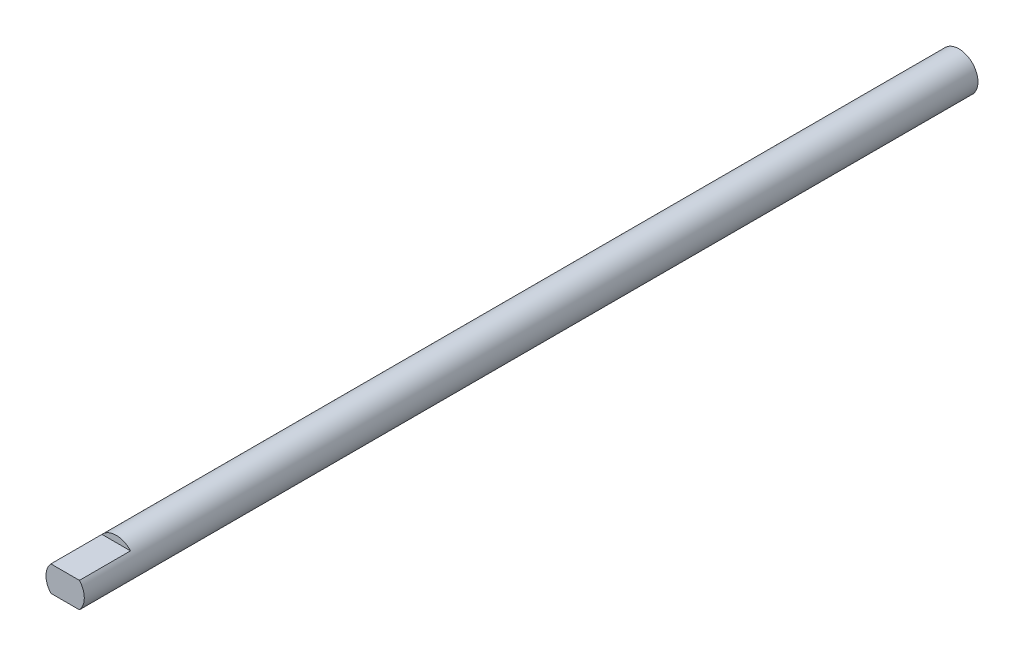
ISO-10303-21;
HEADER;
FILE_DESCRIPTION(('STEP AP214'),'2;1');
FILE_NAME('part.step','',(''),(''),'','','');
FILE_SCHEMA(('AUTOMOTIVE_DESIGN { 1 0 10303 214 1 1 1 1 }'));
ENDSEC;
DATA;
#1=APPLICATION_CONTEXT('core data for automotive mechanical design processes');
#2=APPLICATION_PROTOCOL_DEFINITION('international standard','automotive_design',2000,#1);
#3=PRODUCT_CONTEXT('',#1,'mechanical');
#4=PRODUCT('Part','Part','',(#3));
#5=PRODUCT_RELATED_PRODUCT_CATEGORY('part','',(#4));
#6=PRODUCT_DEFINITION_FORMATION('','',#4);
#7=PRODUCT_DEFINITION_CONTEXT('part definition',#1,'design');
#8=PRODUCT_DEFINITION('design','',#6,#7);
#9=PRODUCT_DEFINITION_SHAPE('','',#8);
#10=(LENGTH_UNIT() NAMED_UNIT(*) SI_UNIT(.MILLI.,.METRE.));
#11=(NAMED_UNIT(*) PLANE_ANGLE_UNIT() SI_UNIT($,.RADIAN.));
#12=(NAMED_UNIT(*) SI_UNIT($,.STERADIAN.) SOLID_ANGLE_UNIT());
#13=UNCERTAINTY_MEASURE_WITH_UNIT(LENGTH_MEASURE(1.E-05),#10,'distance_accuracy_value','');
#14=(GEOMETRIC_REPRESENTATION_CONTEXT(3) GLOBAL_UNCERTAINTY_ASSIGNED_CONTEXT((#13)) GLOBAL_UNIT_ASSIGNED_CONTEXT((#10,
#11,#12)) REPRESENTATION_CONTEXT('',''));
#15=CARTESIAN_POINT('',(0.,0.,0.));
#16=DIRECTION('',(0.,0.,1.));
#17=DIRECTION('',(1.,0.,0.));
#18=AXIS2_PLACEMENT_3D('',#15,#16,#17);
#19=CARTESIAN_POINT('',(0.,0.,70.));
#20=DIRECTION('',(0.,0.,-1.));
#21=DIRECTION('',(-1.,0.,0.));
#22=AXIS2_PLACEMENT_3D('',#19,#20,#21);
#23=CYLINDRICAL_SURFACE('',#22,1.5);
#24=CARTESIAN_POINT('',(0.,0.,70.));
#25=DIRECTION('',(0.,0.,1.));
#26=DIRECTION('',(1.,0.,0.));
#27=AXIS2_PLACEMENT_3D('',#24,#25,#26);
#28=CIRCLE('',#27,1.5);
#29=CARTESIAN_POINT('',(1.1180339887499,-1.,70.));
#30=VERTEX_POINT('',#29);
#31=CARTESIAN_POINT('',(1.1180339887499,1.,70.));
#32=VERTEX_POINT('',#31);
#33=EDGE_CURVE('E87',#30,#32,#28,.T.);
#34=ORIENTED_EDGE('',*,*,#33,.F.);
#35=DIRECTION('',(0.,0.,-1.));
#36=VECTOR('',#35,1.);
#37=CARTESIAN_POINT('',(1.1180339887499,-1.,70.));
#38=LINE('',#37,#36);
#39=CARTESIAN_POINT('',(1.1180339887499,-1.,66.));
#40=VERTEX_POINT('',#39);
#41=EDGE_CURVE('E47',#30,#40,#38,.T.);
#42=ORIENTED_EDGE('',*,*,#41,.T.);
#43=CARTESIAN_POINT('',(0.,0.,66.));
#44=DIRECTION('',(0.,0.,1.));
#45=DIRECTION('',(1.,0.,0.));
#46=AXIS2_PLACEMENT_3D('',#43,#44,#45);
#47=CIRCLE('',#46,1.5);
#48=CARTESIAN_POINT('',(-1.1180339887499,-1.,66.));
#49=VERTEX_POINT('',#48);
#50=EDGE_CURVE('E11',#49,#40,#47,.T.);
#51=ORIENTED_EDGE('',*,*,#50,.F.);
#52=DIRECTION('',(0.,0.,-1.));
#53=VECTOR('',#52,1.);
#54=CARTESIAN_POINT('',(-1.1180339887499,-1.,70.));
#55=LINE('',#54,#53);
#56=CARTESIAN_POINT('',(-1.1180339887499,-1.,70.));
#57=VERTEX_POINT('',#56);
#58=EDGE_CURVE('E100',#49,#57,#55,.F.);
#59=ORIENTED_EDGE('',*,*,#58,.T.);
#60=CARTESIAN_POINT('',(-1.1180339887499,1.,70.));
#61=VERTEX_POINT('',#60);
#62=EDGE_CURVE('E81',#61,#57,#28,.T.);
#63=ORIENTED_EDGE('',*,*,#62,.F.);
#64=DIRECTION('',(0.,0.,-1.));
#65=VECTOR('',#64,1.);
#66=CARTESIAN_POINT('',(-1.1180339887499,1.,70.));
#67=LINE('',#66,#65);
#68=CARTESIAN_POINT('',(-1.1180339887499,1.,66.));
#69=VERTEX_POINT('',#68);
#70=EDGE_CURVE('E55',#61,#69,#67,.T.);
#71=ORIENTED_EDGE('',*,*,#70,.T.);
#72=CARTESIAN_POINT('',(0.,0.,66.));
#73=DIRECTION('',(0.,0.,-1.));
#74=DIRECTION('',(-1.,0.,0.));
#75=AXIS2_PLACEMENT_3D('',#72,#73,#74);
#76=CIRCLE('',#75,1.5);
#77=CARTESIAN_POINT('',(1.1180339887499,1.,66.));
#78=VERTEX_POINT('',#77);
#79=EDGE_CURVE('E40',#69,#78,#76,.T.);
#80=ORIENTED_EDGE('',*,*,#79,.T.);
#81=DIRECTION('',(0.,0.,-1.));
#82=VECTOR('',#81,1.);
#83=CARTESIAN_POINT('',(1.1180339887499,1.,70.));
#84=LINE('',#83,#82);
#85=EDGE_CURVE('E74',#78,#32,#84,.F.);
#86=ORIENTED_EDGE('',*,*,#85,.T.);
#87=EDGE_LOOP('',(#34,#42,#51,#59,#63,#71,#80,#86));
#88=FACE_BOUND('',#87,.T.);
#89=CARTESIAN_POINT('',(0.,0.,0.));
#90=DIRECTION('',(0.,0.,1.));
#91=DIRECTION('',(1.,0.,0.));
#92=AXIS2_PLACEMENT_3D('',#89,#90,#91);
#93=CIRCLE('',#92,1.5);
#94=CARTESIAN_POINT('',(1.5,0.,0.));
#95=VERTEX_POINT('',#94);
#96=EDGE_CURVE('E91',#95,#95,#93,.T.);
#97=ORIENTED_EDGE('',*,*,#96,.T.);
#98=EDGE_LOOP('',(#97));
#99=FACE_BOUND('',#98,.T.);
#100=ADVANCED_FACE('F33',(#88,#99),#23,.T.);
#101=CARTESIAN_POINT('',(0.,0.,70.));
#102=DIRECTION('',(0.,0.,1.));
#103=DIRECTION('',(1.,0.,0.));
#104=AXIS2_PLACEMENT_3D('',#101,#102,#103);
#105=PLANE('',#104);
#106=DIRECTION('',(-1.,0.,0.));
#107=VECTOR('',#106,1.);
#108=CARTESIAN_POINT('',(0.,-1.,70.));
#109=LINE('',#108,#107);
#110=EDGE_CURVE('E80',#30,#57,#109,.T.);
#111=ORIENTED_EDGE('',*,*,#110,.F.);
#112=ORIENTED_EDGE('',*,*,#33,.T.);
#113=DIRECTION('',(1.,0.,0.));
#114=VECTOR('',#113,1.);
#115=CARTESIAN_POINT('',(0.,1.,70.));
#116=LINE('',#115,#114);
#117=EDGE_CURVE('E71',#61,#32,#116,.T.);
#118=ORIENTED_EDGE('',*,*,#117,.F.);
#119=ORIENTED_EDGE('',*,*,#62,.T.);
#120=EDGE_LOOP('',(#111,#112,#118,#119));
#121=FACE_BOUND('',#120,.T.);
#122=ADVANCED_FACE('F90',(#121),#105,.T.);
#123=CARTESIAN_POINT('',(0.,0.,0.));
#124=DIRECTION('',(0.,0.,1.));
#125=DIRECTION('',(1.,0.,0.));
#126=AXIS2_PLACEMENT_3D('',#123,#124,#125);
#127=PLANE('',#126);
#128=ORIENTED_EDGE('',*,*,#96,.F.);
#129=EDGE_LOOP('',(#128));
#130=FACE_BOUND('',#129,.T.);
#131=ADVANCED_FACE('F122',(#130),#127,.F.);
#132=CARTESIAN_POINT('',(0.,0.,66.));
#133=DIRECTION('',(0.,0.,-1.));
#134=DIRECTION('',(-1.,0.,0.));
#135=AXIS2_PLACEMENT_3D('',#132,#133,#134);
#136=PLANE('',#135);
#137=DIRECTION('',(1.,0.,0.));
#138=VECTOR('',#137,1.);
#139=CARTESIAN_POINT('',(2.21452021632995,1.,66.));
#140=LINE('',#139,#138);
#141=EDGE_CURVE('E105',#69,#78,#140,.T.);
#142=ORIENTED_EDGE('',*,*,#141,.T.);
#143=ORIENTED_EDGE('',*,*,#79,.F.);
#144=EDGE_LOOP('',(#142,#143));
#145=FACE_BOUND('',#144,.T.);
#146=ADVANCED_FACE('F116',(#145),#136,.F.);
#147=CARTESIAN_POINT('',(2.21452021632995,1.,66.));
#148=DIRECTION('',(0.,-1.,0.));
#149=DIRECTION('',(1.,0.,0.));
#150=AXIS2_PLACEMENT_3D('',#147,#148,#149);
#151=PLANE('',#150);
#152=ORIENTED_EDGE('',*,*,#117,.T.);
#153=ORIENTED_EDGE('',*,*,#85,.F.);
#154=ORIENTED_EDGE('',*,*,#141,.F.);
#155=ORIENTED_EDGE('',*,*,#70,.F.);
#156=EDGE_LOOP('',(#152,#153,#154,#155));
#157=FACE_BOUND('',#156,.T.);
#158=ADVANCED_FACE('F73',(#157),#151,.F.);
#159=CARTESIAN_POINT('',(0.,0.,66.));
#160=DIRECTION('',(0.,0.,1.));
#161=DIRECTION('',(1.,0.,0.));
#162=AXIS2_PLACEMENT_3D('',#159,#160,#161);
#163=PLANE('',#162);
#164=ORIENTED_EDGE('',*,*,#50,.T.);
#165=DIRECTION('',(-1.,0.,0.));
#166=VECTOR('',#165,1.);
#167=CARTESIAN_POINT('',(2.21452021632995,-1.,66.));
#168=LINE('',#167,#166);
#169=EDGE_CURVE('E88',#40,#49,#168,.T.);
#170=ORIENTED_EDGE('',*,*,#169,.T.);
#171=EDGE_LOOP('',(#164,#170));
#172=FACE_BOUND('',#171,.T.);
#173=ADVANCED_FACE('F108',(#172),#163,.T.);
#174=CARTESIAN_POINT('',(2.21452021632995,-1.,66.));
#175=DIRECTION('',(0.,1.,0.));
#176=DIRECTION('',(-1.,0.,0.));
#177=AXIS2_PLACEMENT_3D('',#174,#175,#176);
#178=PLANE('',#177);
#179=ORIENTED_EDGE('',*,*,#110,.T.);
#180=ORIENTED_EDGE('',*,*,#58,.F.);
#181=ORIENTED_EDGE('',*,*,#169,.F.);
#182=ORIENTED_EDGE('',*,*,#41,.F.);
#183=EDGE_LOOP('',(#179,#180,#181,#182));
#184=FACE_BOUND('',#183,.T.);
#185=ADVANCED_FACE('F99',(#184),#178,.F.);
#186=CLOSED_SHELL('',(#100,#122,#131,#146,#158,#173,#185));
#187=MANIFOLD_SOLID_BREP('B2',#186);
#188=ADVANCED_BREP_SHAPE_REPRESENTATION('',(#18,#187),#14);
#189=SHAPE_DEFINITION_REPRESENTATION(#9,#188);
ENDSEC;
END-ISO-10303-21;
